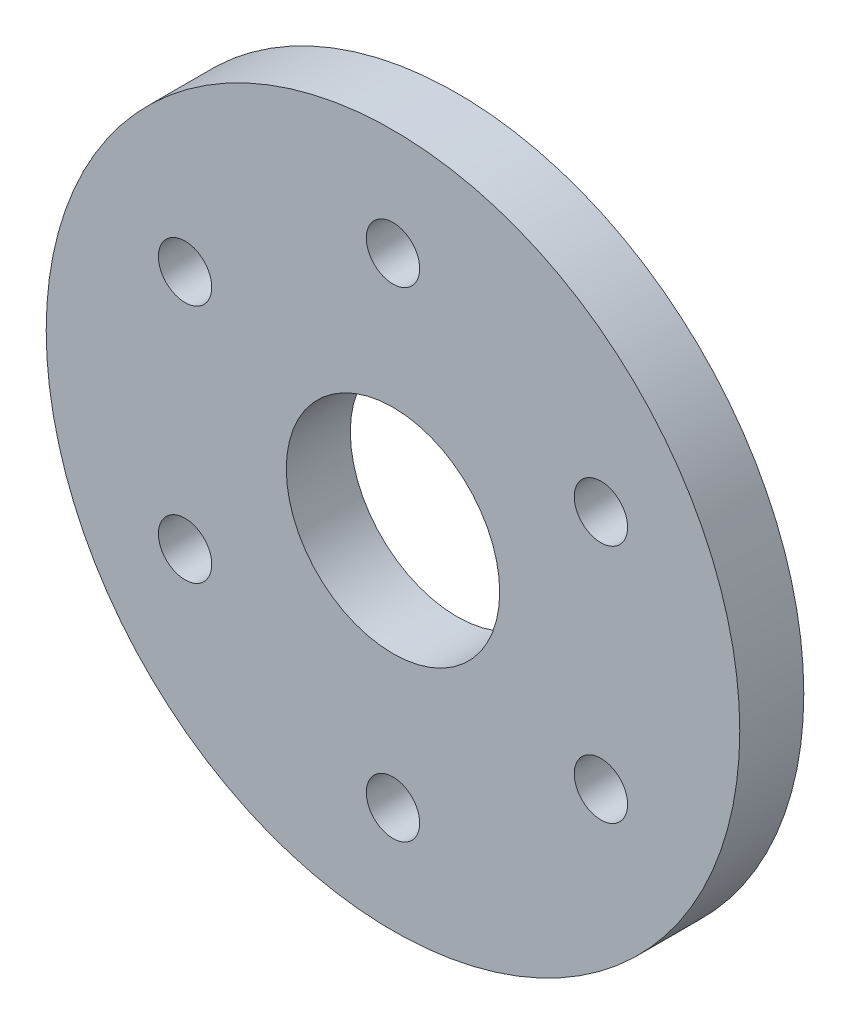
ISO-10303-21;
HEADER;
FILE_DESCRIPTION(('STEP AP214'),'2;1');
FILE_NAME('part.step','',(''),(''),'','','');
FILE_SCHEMA(('AUTOMOTIVE_DESIGN { 1 0 10303 214 1 1 1 1 }'));
ENDSEC;
DATA;
#1=APPLICATION_CONTEXT('core data for automotive mechanical design processes');
#2=APPLICATION_PROTOCOL_DEFINITION('international standard','automotive_design',2000,#1);
#3=PRODUCT_CONTEXT('',#1,'mechanical');
#4=PRODUCT('Part','Part','',(#3));
#5=PRODUCT_RELATED_PRODUCT_CATEGORY('part','',(#4));
#6=PRODUCT_DEFINITION_FORMATION('','',#4);
#7=PRODUCT_DEFINITION_CONTEXT('part definition',#1,'design');
#8=PRODUCT_DEFINITION('design','',#6,#7);
#9=PRODUCT_DEFINITION_SHAPE('','',#8);
#10=(LENGTH_UNIT() NAMED_UNIT(*) SI_UNIT(.MILLI.,.METRE.));
#11=(NAMED_UNIT(*) PLANE_ANGLE_UNIT() SI_UNIT($,.RADIAN.));
#12=(NAMED_UNIT(*) SI_UNIT($,.STERADIAN.) SOLID_ANGLE_UNIT());
#13=UNCERTAINTY_MEASURE_WITH_UNIT(LENGTH_MEASURE(1.E-05),#10,'distance_accuracy_value','');
#14=(GEOMETRIC_REPRESENTATION_CONTEXT(3) GLOBAL_UNCERTAINTY_ASSIGNED_CONTEXT((#13)) GLOBAL_UNIT_ASSIGNED_CONTEXT((#10,
#11,#12)) REPRESENTATION_CONTEXT('',''));
#15=CARTESIAN_POINT('',(0.,0.,0.));
#16=DIRECTION('',(0.,0.,1.));
#17=DIRECTION('',(1.,0.,0.));
#18=AXIS2_PLACEMENT_3D('',#15,#16,#17);
#19=CARTESIAN_POINT('',(0.,0.,6.));
#20=DIRECTION('',(0.,0.,1.));
#21=DIRECTION('',(1.,0.,0.));
#22=AXIS2_PLACEMENT_3D('',#19,#20,#21);
#23=PLANE('',#22);
#24=CARTESIAN_POINT('',(0.,22.5,6.));
#25=DIRECTION('',(0.,0.,1.));
#26=DIRECTION('',(1.,0.,0.));
#27=AXIS2_PLACEMENT_3D('',#24,#25,#26);
#28=CIRCLE('',#27,2.5);
#29=CARTESIAN_POINT('',(2.5,22.5,6.));
#30=VERTEX_POINT('',#29);
#31=EDGE_CURVE('E83',#30,#30,#28,.T.);
#32=ORIENTED_EDGE('',*,*,#31,.F.);
#33=EDGE_LOOP('',(#32));
#34=FACE_BOUND('',#33,.T.);
#35=CARTESIAN_POINT('',(-19.4855715851499,11.25,6.));
#36=DIRECTION('',(0.,0.,1.));
#37=DIRECTION('',(1.,0.,0.));
#38=AXIS2_PLACEMENT_3D('',#35,#36,#37);
#39=CIRCLE('',#38,2.5);
#40=CARTESIAN_POINT('',(-16.9855715851499,11.25,6.));
#41=VERTEX_POINT('',#40);
#42=EDGE_CURVE('E62',#41,#41,#39,.T.);
#43=ORIENTED_EDGE('',*,*,#42,.F.);
#44=EDGE_LOOP('',(#43));
#45=FACE_BOUND('',#44,.T.);
#46=CARTESIAN_POINT('',(-19.4855715851499,-11.25,6.));
#47=DIRECTION('',(0.,0.,1.));
#48=DIRECTION('',(1.,0.,0.));
#49=AXIS2_PLACEMENT_3D('',#46,#47,#48);
#50=CIRCLE('',#49,2.5);
#51=CARTESIAN_POINT('',(-16.9855715851499,-11.25,6.));
#52=VERTEX_POINT('',#51);
#53=EDGE_CURVE('E61',#52,#52,#50,.T.);
#54=ORIENTED_EDGE('',*,*,#53,.F.);
#55=EDGE_LOOP('',(#54));
#56=FACE_BOUND('',#55,.T.);
#57=CARTESIAN_POINT('',(0.,-22.5,6.));
#58=DIRECTION('',(0.,0.,1.));
#59=DIRECTION('',(1.,0.,0.));
#60=AXIS2_PLACEMENT_3D('',#57,#58,#59);
#61=CIRCLE('',#60,2.5);
#62=CARTESIAN_POINT('',(2.5,-22.5,6.));
#63=VERTEX_POINT('',#62);
#64=EDGE_CURVE('E68',#63,#63,#61,.T.);
#65=ORIENTED_EDGE('',*,*,#64,.F.);
#66=EDGE_LOOP('',(#65));
#67=FACE_BOUND('',#66,.T.);
#68=CARTESIAN_POINT('',(19.4855715851499,-11.25,6.));
#69=DIRECTION('',(0.,0.,1.));
#70=DIRECTION('',(1.,0.,0.));
#71=AXIS2_PLACEMENT_3D('',#68,#69,#70);
#72=CIRCLE('',#71,2.5);
#73=CARTESIAN_POINT('',(21.9855715851499,-11.25,6.));
#74=VERTEX_POINT('',#73);
#75=EDGE_CURVE('E74',#74,#74,#72,.T.);
#76=ORIENTED_EDGE('',*,*,#75,.F.);
#77=EDGE_LOOP('',(#76));
#78=FACE_BOUND('',#77,.T.);
#79=CARTESIAN_POINT('',(19.4855715851499,11.25,6.));
#80=DIRECTION('',(0.,0.,1.));
#81=DIRECTION('',(1.,0.,0.));
#82=AXIS2_PLACEMENT_3D('',#79,#80,#81);
#83=CIRCLE('',#82,2.5);
#84=CARTESIAN_POINT('',(21.9855715851499,11.25,6.));
#85=VERTEX_POINT('',#84);
#86=EDGE_CURVE('E80',#85,#85,#83,.T.);
#87=ORIENTED_EDGE('',*,*,#86,.F.);
#88=EDGE_LOOP('',(#87));
#89=FACE_BOUND('',#88,.T.);
#90=CARTESIAN_POINT('',(0.,0.,6.));
#91=DIRECTION('',(0.,0.,1.));
#92=DIRECTION('',(1.,0.,0.));
#93=AXIS2_PLACEMENT_3D('',#90,#91,#92);
#94=CIRCLE('',#93,32.5);
#95=CARTESIAN_POINT('',(32.5,0.,6.));
#96=VERTEX_POINT('',#95);
#97=EDGE_CURVE('E10',#96,#96,#94,.T.);
#98=ORIENTED_EDGE('',*,*,#97,.T.);
#99=EDGE_LOOP('',(#98));
#100=FACE_BOUND('',#99,.T.);
#101=CARTESIAN_POINT('',(0.,0.,6.));
#102=DIRECTION('',(0.,0.,1.));
#103=DIRECTION('',(1.,0.,0.));
#104=AXIS2_PLACEMENT_3D('',#101,#102,#103);
#105=CIRCLE('',#104,10.);
#106=CARTESIAN_POINT('',(10.,0.,6.));
#107=VERTEX_POINT('',#106);
#108=EDGE_CURVE('E50',#107,#107,#105,.T.);
#109=ORIENTED_EDGE('',*,*,#108,.F.);
#110=EDGE_LOOP('',(#109));
#111=FACE_BOUND('',#110,.T.);
#112=ADVANCED_FACE('F39',(#34,#45,#56,#67,#78,#89,#100,#111),#23,.T.);
#113=CARTESIAN_POINT('',(0.,0.,0.));
#114=DIRECTION('',(0.,0.,1.));
#115=DIRECTION('',(1.,0.,0.));
#116=AXIS2_PLACEMENT_3D('',#113,#114,#115);
#117=PLANE('',#116);
#118=CARTESIAN_POINT('',(0.,22.5,0.));
#119=DIRECTION('',(0.,0.,1.));
#120=DIRECTION('',(1.,0.,0.));
#121=AXIS2_PLACEMENT_3D('',#118,#119,#120);
#122=CIRCLE('',#121,2.5);
#123=CARTESIAN_POINT('',(2.5,22.5,0.));
#124=VERTEX_POINT('',#123);
#125=EDGE_CURVE('E55',#124,#124,#122,.T.);
#126=ORIENTED_EDGE('',*,*,#125,.T.);
#127=EDGE_LOOP('',(#126));
#128=FACE_BOUND('',#127,.T.);
#129=CARTESIAN_POINT('',(-19.4855715851499,11.25,0.));
#130=DIRECTION('',(0.,0.,1.));
#131=DIRECTION('',(1.,0.,0.));
#132=AXIS2_PLACEMENT_3D('',#129,#130,#131);
#133=CIRCLE('',#132,2.5);
#134=CARTESIAN_POINT('',(-16.9855715851499,11.25,0.));
#135=VERTEX_POINT('',#134);
#136=EDGE_CURVE('E84',#135,#135,#133,.T.);
#137=ORIENTED_EDGE('',*,*,#136,.T.);
#138=EDGE_LOOP('',(#137));
#139=FACE_BOUND('',#138,.T.);
#140=CARTESIAN_POINT('',(-19.4855715851499,-11.25,0.));
#141=DIRECTION('',(0.,0.,1.));
#142=DIRECTION('',(1.,0.,0.));
#143=AXIS2_PLACEMENT_3D('',#140,#141,#142);
#144=CIRCLE('',#143,2.5);
#145=CARTESIAN_POINT('',(-16.9855715851499,-11.25,0.));
#146=VERTEX_POINT('',#145);
#147=EDGE_CURVE('E58',#146,#146,#144,.T.);
#148=ORIENTED_EDGE('',*,*,#147,.T.);
#149=EDGE_LOOP('',(#148));
#150=FACE_BOUND('',#149,.T.);
#151=CARTESIAN_POINT('',(0.,-22.5,0.));
#152=DIRECTION('',(0.,0.,1.));
#153=DIRECTION('',(1.,0.,0.));
#154=AXIS2_PLACEMENT_3D('',#151,#152,#153);
#155=CIRCLE('',#154,2.5);
#156=CARTESIAN_POINT('',(2.5,-22.5,0.));
#157=VERTEX_POINT('',#156);
#158=EDGE_CURVE('E65',#157,#157,#155,.T.);
#159=ORIENTED_EDGE('',*,*,#158,.T.);
#160=EDGE_LOOP('',(#159));
#161=FACE_BOUND('',#160,.T.);
#162=CARTESIAN_POINT('',(19.4855715851499,-11.25,0.));
#163=DIRECTION('',(0.,0.,1.));
#164=DIRECTION('',(1.,0.,0.));
#165=AXIS2_PLACEMENT_3D('',#162,#163,#164);
#166=CIRCLE('',#165,2.5);
#167=CARTESIAN_POINT('',(21.9855715851499,-11.25,0.));
#168=VERTEX_POINT('',#167);
#169=EDGE_CURVE('E71',#168,#168,#166,.T.);
#170=ORIENTED_EDGE('',*,*,#169,.T.);
#171=EDGE_LOOP('',(#170));
#172=FACE_BOUND('',#171,.T.);
#173=CARTESIAN_POINT('',(19.4855715851499,11.25,0.));
#174=DIRECTION('',(0.,0.,1.));
#175=DIRECTION('',(1.,0.,0.));
#176=AXIS2_PLACEMENT_3D('',#173,#174,#175);
#177=CIRCLE('',#176,2.5);
#178=CARTESIAN_POINT('',(21.9855715851499,11.25,0.));
#179=VERTEX_POINT('',#178);
#180=EDGE_CURVE('E77',#179,#179,#177,.T.);
#181=ORIENTED_EDGE('',*,*,#180,.T.);
#182=EDGE_LOOP('',(#181));
#183=FACE_BOUND('',#182,.T.);
#184=CARTESIAN_POINT('',(0.,0.,0.));
#185=DIRECTION('',(0.,0.,1.));
#186=DIRECTION('',(1.,0.,0.));
#187=AXIS2_PLACEMENT_3D('',#184,#185,#186);
#188=CIRCLE('',#187,32.5);
#189=CARTESIAN_POINT('',(32.5,0.,0.));
#190=VERTEX_POINT('',#189);
#191=EDGE_CURVE('E43',#190,#190,#188,.T.);
#192=ORIENTED_EDGE('',*,*,#191,.F.);
#193=EDGE_LOOP('',(#192));
#194=FACE_BOUND('',#193,.T.);
#195=CARTESIAN_POINT('',(0.,0.,0.));
#196=DIRECTION('',(0.,0.,1.));
#197=DIRECTION('',(1.,0.,0.));
#198=AXIS2_PLACEMENT_3D('',#195,#196,#197);
#199=CIRCLE('',#198,10.);
#200=CARTESIAN_POINT('',(10.,0.,0.));
#201=VERTEX_POINT('',#200);
#202=EDGE_CURVE('E52',#201,#201,#199,.T.);
#203=ORIENTED_EDGE('',*,*,#202,.T.);
#204=EDGE_LOOP('',(#203));
#205=FACE_BOUND('',#204,.T.);
#206=ADVANCED_FACE('F94',(#128,#139,#150,#161,#172,#183,#194,#205),#117,.F.);
#207=CARTESIAN_POINT('',(0.,0.,6.));
#208=DIRECTION('',(0.,0.,-1.));
#209=DIRECTION('',(-1.,0.,0.));
#210=AXIS2_PLACEMENT_3D('',#207,#208,#209);
#211=CYLINDRICAL_SURFACE('',#210,32.5);
#212=ORIENTED_EDGE('',*,*,#97,.F.);
#213=EDGE_LOOP('',(#212));
#214=FACE_BOUND('',#213,.T.);
#215=ORIENTED_EDGE('',*,*,#191,.T.);
#216=EDGE_LOOP('',(#215));
#217=FACE_BOUND('',#216,.T.);
#218=ADVANCED_FACE('F41',(#214,#217),#211,.T.);
#219=CARTESIAN_POINT('',(0.,0.,6.));
#220=DIRECTION('',(0.,0.,-1.));
#221=DIRECTION('',(-1.,0.,0.));
#222=AXIS2_PLACEMENT_3D('',#219,#220,#221);
#223=CYLINDRICAL_SURFACE('',#222,10.);
#224=ORIENTED_EDGE('',*,*,#108,.T.);
#225=EDGE_LOOP('',(#224));
#226=FACE_BOUND('',#225,.T.);
#227=ORIENTED_EDGE('',*,*,#202,.F.);
#228=EDGE_LOOP('',(#227));
#229=FACE_BOUND('',#228,.T.);
#230=ADVANCED_FACE('F119',(#226,#229),#223,.F.);
#231=CARTESIAN_POINT('',(19.4855715851499,11.25,0.));
#232=DIRECTION('',(0.,0.,1.));
#233=DIRECTION('',(1.,0.,0.));
#234=AXIS2_PLACEMENT_3D('',#231,#232,#233);
#235=CYLINDRICAL_SURFACE('',#234,2.5);
#236=ORIENTED_EDGE('',*,*,#180,.F.);
#237=EDGE_LOOP('',(#236));
#238=FACE_BOUND('',#237,.T.);
#239=ORIENTED_EDGE('',*,*,#86,.T.);
#240=EDGE_LOOP('',(#239));
#241=FACE_BOUND('',#240,.T.);
#242=ADVANCED_FACE('F122',(#238,#241),#235,.F.);
#243=CARTESIAN_POINT('',(19.4855715851499,-11.25,0.));
#244=DIRECTION('',(0.,0.,1.));
#245=DIRECTION('',(1.,0.,0.));
#246=AXIS2_PLACEMENT_3D('',#243,#244,#245);
#247=CYLINDRICAL_SURFACE('',#246,2.5);
#248=ORIENTED_EDGE('',*,*,#169,.F.);
#249=EDGE_LOOP('',(#248));
#250=FACE_BOUND('',#249,.T.);
#251=ORIENTED_EDGE('',*,*,#75,.T.);
#252=EDGE_LOOP('',(#251));
#253=FACE_BOUND('',#252,.T.);
#254=ADVANCED_FACE('F140',(#250,#253),#247,.F.);
#255=CARTESIAN_POINT('',(0.,-22.5,0.));
#256=DIRECTION('',(0.,0.,1.));
#257=DIRECTION('',(1.,0.,0.));
#258=AXIS2_PLACEMENT_3D('',#255,#256,#257);
#259=CYLINDRICAL_SURFACE('',#258,2.5);
#260=ORIENTED_EDGE('',*,*,#158,.F.);
#261=EDGE_LOOP('',(#260));
#262=FACE_BOUND('',#261,.T.);
#263=ORIENTED_EDGE('',*,*,#64,.T.);
#264=EDGE_LOOP('',(#263));
#265=FACE_BOUND('',#264,.T.);
#266=ADVANCED_FACE('F136',(#262,#265),#259,.F.);
#267=CARTESIAN_POINT('',(-19.4855715851499,-11.25,0.));
#268=DIRECTION('',(0.,0.,1.));
#269=DIRECTION('',(1.,0.,0.));
#270=AXIS2_PLACEMENT_3D('',#267,#268,#269);
#271=CYLINDRICAL_SURFACE('',#270,2.5);
#272=ORIENTED_EDGE('',*,*,#147,.F.);
#273=EDGE_LOOP('',(#272));
#274=FACE_BOUND('',#273,.T.);
#275=ORIENTED_EDGE('',*,*,#53,.T.);
#276=EDGE_LOOP('',(#275));
#277=FACE_BOUND('',#276,.T.);
#278=ADVANCED_FACE('F133',(#274,#277),#271,.F.);
#279=CARTESIAN_POINT('',(-19.4855715851499,11.25,0.));
#280=DIRECTION('',(0.,0.,1.));
#281=DIRECTION('',(1.,0.,0.));
#282=AXIS2_PLACEMENT_3D('',#279,#280,#281);
#283=CYLINDRICAL_SURFACE('',#282,2.5);
#284=ORIENTED_EDGE('',*,*,#136,.F.);
#285=EDGE_LOOP('',(#284));
#286=FACE_BOUND('',#285,.T.);
#287=ORIENTED_EDGE('',*,*,#42,.T.);
#288=EDGE_LOOP('',(#287));
#289=FACE_BOUND('',#288,.T.);
#290=ADVANCED_FACE('F100',(#286,#289),#283,.F.);
#291=CARTESIAN_POINT('',(0.,22.5,0.));
#292=DIRECTION('',(0.,0.,1.));
#293=DIRECTION('',(1.,0.,0.));
#294=AXIS2_PLACEMENT_3D('',#291,#292,#293);
#295=CYLINDRICAL_SURFACE('',#294,2.5);
#296=ORIENTED_EDGE('',*,*,#125,.F.);
#297=EDGE_LOOP('',(#296));
#298=FACE_BOUND('',#297,.T.);
#299=ORIENTED_EDGE('',*,*,#31,.T.);
#300=EDGE_LOOP('',(#299));
#301=FACE_BOUND('',#300,.T.);
#302=ADVANCED_FACE('F97',(#298,#301),#295,.F.);
#303=CLOSED_SHELL('',(#112,#206,#218,#230,#242,#254,#266,#278,#290,#302));
#304=MANIFOLD_SOLID_BREP('B2',#303);
#305=ADVANCED_BREP_SHAPE_REPRESENTATION('',(#18,#304),#14);
#306=SHAPE_DEFINITION_REPRESENTATION(#9,#305);
ENDSEC;
END-ISO-10303-21;
